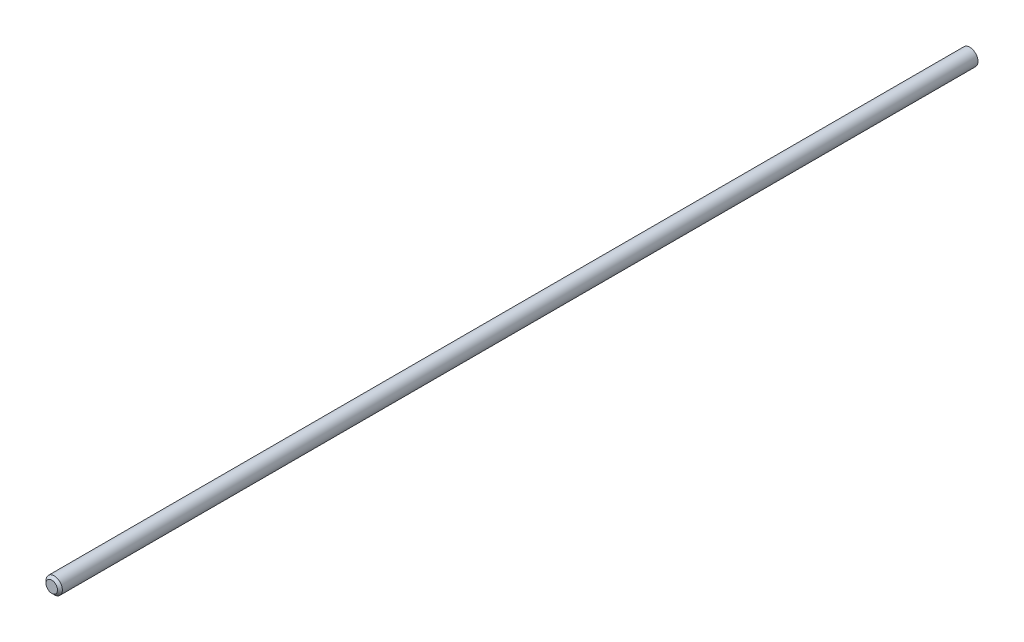
ISO-10303-21;
HEADER;
FILE_DESCRIPTION(('STEP AP214'),'2;1');
FILE_NAME('part.step','',(''),(''),'','','');
FILE_SCHEMA(('AUTOMOTIVE_DESIGN { 1 0 10303 214 1 1 1 1 }'));
ENDSEC;
DATA;
#1=APPLICATION_CONTEXT('core data for automotive mechanical design processes');
#2=APPLICATION_PROTOCOL_DEFINITION('international standard','automotive_design',2000,#1);
#3=PRODUCT_CONTEXT('',#1,'mechanical');
#4=PRODUCT('Part','Part','',(#3));
#5=PRODUCT_RELATED_PRODUCT_CATEGORY('part','',(#4));
#6=PRODUCT_DEFINITION_FORMATION('','',#4);
#7=PRODUCT_DEFINITION_CONTEXT('part definition',#1,'design');
#8=PRODUCT_DEFINITION('design','',#6,#7);
#9=PRODUCT_DEFINITION_SHAPE('','',#8);
#10=(LENGTH_UNIT() NAMED_UNIT(*) SI_UNIT(.MILLI.,.METRE.));
#11=(NAMED_UNIT(*) PLANE_ANGLE_UNIT() SI_UNIT($,.RADIAN.));
#12=(NAMED_UNIT(*) SI_UNIT($,.STERADIAN.) SOLID_ANGLE_UNIT());
#13=UNCERTAINTY_MEASURE_WITH_UNIT(LENGTH_MEASURE(1.E-05),#10,'distance_accuracy_value','');
#14=(GEOMETRIC_REPRESENTATION_CONTEXT(3) GLOBAL_UNCERTAINTY_ASSIGNED_CONTEXT((#13)) GLOBAL_UNIT_ASSIGNED_CONTEXT((#10,
#11,#12)) REPRESENTATION_CONTEXT('',''));
#15=CARTESIAN_POINT('',(0.,0.,0.));
#16=DIRECTION('',(0.,0.,1.));
#17=DIRECTION('',(1.,0.,0.));
#18=AXIS2_PLACEMENT_3D('',#15,#16,#17);
#19=CARTESIAN_POINT('',(0.,0.,304.8));
#20=DIRECTION('',(0.,0.,-1.));
#21=DIRECTION('',(-1.,0.,0.));
#22=AXIS2_PLACEMENT_3D('',#19,#20,#21);
#23=PLANE('',#22);
#24=CARTESIAN_POINT('',(0.,0.,304.8));
#25=DIRECTION('',(0.,0.,-1.));
#26=DIRECTION('',(-1.,0.,0.));
#27=AXIS2_PLACEMENT_3D('',#24,#25,#26);
#28=CIRCLE('',#27,2.22249999999996);
#29=CARTESIAN_POINT('',(-2.22249999999993,0.,304.8));
#30=VERTEX_POINT('',#29);
#31=EDGE_CURVE('E50',#30,#30,#28,.F.);
#32=ORIENTED_EDGE('',*,*,#31,.T.);
#33=EDGE_LOOP('',(#32));
#34=FACE_BOUND('',#33,.T.);
#35=ADVANCED_FACE('F42',(#34),#23,.F.);
#36=CARTESIAN_POINT('',(0.,0.,304.8));
#37=DIRECTION('',(0.,0.,1.));
#38=DIRECTION('',(1.,0.,0.));
#39=AXIS2_PLACEMENT_3D('',#36,#37,#38);
#40=CYLINDRICAL_SURFACE('',#39,3.17500000000011);
#41=CARTESIAN_POINT('',(0.,0.,-50.7999999999999));
#42=DIRECTION('',(0.,0.,1.));
#43=DIRECTION('',(1.,0.,0.));
#44=AXIS2_PLACEMENT_3D('',#41,#42,#43);
#45=CIRCLE('',#44,3.17500000000011);
#46=CARTESIAN_POINT('',(3.17500000000011,0.,-50.7999999999999));
#47=VERTEX_POINT('',#46);
#48=EDGE_CURVE('E10',#47,#47,#45,.T.);
#49=ORIENTED_EDGE('',*,*,#48,.T.);
#50=EDGE_LOOP('',(#49));
#51=FACE_BOUND('',#50,.T.);
#52=CARTESIAN_POINT('',(0.,0.,303.8475));
#53=DIRECTION('',(0.,0.,-1.));
#54=DIRECTION('',(-1.,0.,0.));
#55=AXIS2_PLACEMENT_3D('',#52,#53,#54);
#56=CIRCLE('',#55,3.17500000000011);
#57=CARTESIAN_POINT('',(-3.17500000000008,0.,303.8475));
#58=VERTEX_POINT('',#57);
#59=EDGE_CURVE('E55',#58,#58,#56,.T.);
#60=ORIENTED_EDGE('',*,*,#59,.T.);
#61=EDGE_LOOP('',(#60));
#62=FACE_BOUND('',#61,.T.);
#63=ADVANCED_FACE('F63',(#51,#62),#40,.T.);
#64=CARTESIAN_POINT('',(0.,0.,304.8));
#65=DIRECTION('',(0.,0.,-1.));
#66=DIRECTION('',(-1.,0.,0.));
#67=AXIS2_PLACEMENT_3D('',#64,#65,#66);
#68=CONICAL_SURFACE('',#67,2.22249999999996,0.785398163397458);
#69=CARTESIAN_POINT('',(-3.17500000000008,0.,303.8475));
#70=CARTESIAN_POINT('',(-3.16507812500007,0.,303.857421875));
#71=CARTESIAN_POINT('',(-3.15515625000007,0.,303.86734375));
#72=CARTESIAN_POINT('',(-3.13531250000007,0.,303.8871875));
#73=CARTESIAN_POINT('',(-3.12539062500008,0.,303.897109375));
#74=CARTESIAN_POINT('',(-3.10554687500007,0.,303.916953125));
#75=CARTESIAN_POINT('',(-3.09562500000007,0.,303.926875));
#76=CARTESIAN_POINT('',(-3.07578125000007,0.,303.94671875));
#77=CARTESIAN_POINT('',(-3.06585937500007,0.,303.956640625));
#78=CARTESIAN_POINT('',(-3.04601562500006,0.,303.976484375));
#79=CARTESIAN_POINT('',(-3.03609375000006,0.,303.98640625));
#80=CARTESIAN_POINT('',(-3.01625000000006,0.,304.00625));
#81=CARTESIAN_POINT('',(-3.00632812500006,0.,304.016171875));
#82=CARTESIAN_POINT('',(-2.98648437500005,0.,304.036015625));
#83=CARTESIAN_POINT('',(-2.97656250000005,0.,304.0459375));
#84=CARTESIAN_POINT('',(-2.95671875000005,0.,304.06578125));
#85=CARTESIAN_POINT('',(-2.94679687500005,0.,304.075703125));
#86=CARTESIAN_POINT('',(-2.92695312500005,0.,304.095546875));
#87=CARTESIAN_POINT('',(-2.91703125000004,0.,304.10546875));
#88=CARTESIAN_POINT('',(-2.89718750000003,0.,304.1253125));
#89=CARTESIAN_POINT('',(-2.88726562500004,0.,304.135234375));
#90=CARTESIAN_POINT('',(-2.86742187500004,0.,304.155078125));
#91=CARTESIAN_POINT('',(-2.85750000000003,0.,304.165));
#92=CARTESIAN_POINT('',(-2.83765625000003,0.,304.18484375));
#93=CARTESIAN_POINT('',(-2.82773437500003,0.,304.194765625));
#94=CARTESIAN_POINT('',(-2.80789062500003,0.,304.214609375));
#95=CARTESIAN_POINT('',(-2.79796875000002,0.,304.22453125));
#96=CARTESIAN_POINT('',(-2.77812500000002,0.,304.244375));
#97=CARTESIAN_POINT('',(-2.76820312500002,0.,304.254296875));
#98=CARTESIAN_POINT('',(-2.74835937500002,0.,304.274140625));
#99=CARTESIAN_POINT('',(-2.73843750000001,0.,304.2840625));
#100=CARTESIAN_POINT('',(-2.71859375000001,0.,304.30390625));
#101=CARTESIAN_POINT('',(-2.70867187500002,0.,304.313828125));
#102=CARTESIAN_POINT('',(-2.68882812500001,0.,304.333671875));
#103=CARTESIAN_POINT('',(-2.67890625,0.,304.34359375));
#104=CARTESIAN_POINT('',(-2.6590625,0.,304.3634375));
#105=CARTESIAN_POINT('',(-2.649140625,0.,304.373359375));
#106=CARTESIAN_POINT('',(-2.629296875,0.,304.393203125));
#107=CARTESIAN_POINT('',(-2.619375,0.,304.403125));
#108=CARTESIAN_POINT('',(-2.59953124999999,0.,304.42296875));
#109=CARTESIAN_POINT('',(-2.58960937499999,0.,304.432890625));
#110=CARTESIAN_POINT('',(-2.56976562499999,0.,304.452734375));
#111=CARTESIAN_POINT('',(-2.55984374999999,0.,304.46265625));
#112=CARTESIAN_POINT('',(-2.53999999999998,0.,304.4825));
#113=CARTESIAN_POINT('',(-2.53007812499998,0.,304.492421875));
#114=CARTESIAN_POINT('',(-2.51023437499998,0.,304.512265625));
#115=CARTESIAN_POINT('',(-2.50031249999997,0.,304.5221875));
#116=CARTESIAN_POINT('',(-2.48046874999997,0.,304.54203125));
#117=CARTESIAN_POINT('',(-2.47054687499998,0.,304.551953125));
#118=CARTESIAN_POINT('',(-2.45070312499997,0.,304.571796875));
#119=CARTESIAN_POINT('',(-2.44078124999996,0.,304.58171875));
#120=CARTESIAN_POINT('',(-2.42093749999996,0.,304.6015625));
#121=CARTESIAN_POINT('',(-2.41101562499996,0.,304.611484375));
#122=CARTESIAN_POINT('',(-2.39117187499996,0.,304.631328125));
#123=CARTESIAN_POINT('',(-2.38124999999996,0.,304.64125));
#124=CARTESIAN_POINT('',(-2.36140624999995,0.,304.66109375));
#125=CARTESIAN_POINT('',(-2.35148437499995,0.,304.671015625));
#126=CARTESIAN_POINT('',(-2.33164062499995,0.,304.690859375));
#127=CARTESIAN_POINT('',(-2.32171874999995,0.,304.70078125));
#128=CARTESIAN_POINT('',(-2.30187499999994,0.,304.720625));
#129=CARTESIAN_POINT('',(-2.29195312499994,0.,304.730546875));
#130=CARTESIAN_POINT('',(-2.27210937499994,0.,304.750390625));
#131=CARTESIAN_POINT('',(-2.26218749999994,0.,304.7603125));
#132=CARTESIAN_POINT('',(-2.24234374999994,0.,304.78015625));
#133=CARTESIAN_POINT('',(-2.23242187499994,0.,304.790078125));
#134=CARTESIAN_POINT('',(-2.22249999999993,0.,304.8));
#135=B_SPLINE_CURVE_WITH_KNOTS('',3,(#69,#70,#71,#72,#73,#74,#75,#76,#77,#78,#79,#80,#81,#82,
#83,#84,#85,#86,#87,#88,#89,#90,#91,#92,#93,#94,#95,#96,#97,#98,#99,#100,#101,#102,#103,#104,
#105,#106,#107,#108,#109,#110,#111,#112,#113,#114,#115,#116,#117,#118,#119,#120,#121,#122,#123,
#124,#125,#126,#127,#128,#129,#130,#131,#132,#133,#134),.UNSPECIFIED.,.F.,.F.,(4,2,2,2,2,2,2,2,
2,2,2,2,2,2,2,2,2,2,2,2,2,2,2,2,2,2,2,2,2,2,2,2,4),(0.,0.0420949505674835,0.0841899011350063,
0.126284851702529,0.168379802270052,0.210474752837575,0.252569703405098,0.294664653972621,
0.336759604540144,0.378854555107627,0.42094950567515,0.463044456242673,0.505139406810196,
0.547234357377719,0.589329307945242,0.631424258512765,0.673519209080287,0.715614159647771,
0.757709110215294,0.799804060782817,0.84189901135034,0.883993961917863,0.926088912485386,
0.968183863052909,1.01027881362043,1.05237376418792,1.09446871475544,1.13656366532296,
1.17865861589048,1.22075356645801,1.26284851702553,1.30494346759305,1.34703841816054),.UNSPECIFIED.);
#136=EDGE_CURVE('BSEAM44',#58,#30,#135,.T.);
#137=ORIENTED_EDGE('',*,*,#59,.F.);
#138=ORIENTED_EDGE('',*,*,#31,.F.);
#139=ORIENTED_EDGE('',*,*,#136,.T.);
#140=ORIENTED_EDGE('',*,*,#136,.F.);
#141=EDGE_LOOP('',(#137,#139,#138,#140));
#142=FACE_BOUND('',#141,.T.);
#143=ADVANCED_FACE('F44',(#142),#68,.T.);
#144=CARTESIAN_POINT('',(-3.17500000000011,25.4,-50.7999999999999));
#145=DIRECTION('',(0.,0.,1.));
#146=DIRECTION('',(1.,0.,0.));
#147=AXIS2_PLACEMENT_3D('',#144,#145,#146);
#148=PLANE('',#147);
#149=ORIENTED_EDGE('',*,*,#48,.F.);
#150=EDGE_LOOP('',(#149));
#151=FACE_BOUND('',#150,.T.);
#152=ADVANCED_FACE('F67',(#151),#148,.F.);
#153=CLOSED_SHELL('',(#35,#63,#143,#152));
#154=MANIFOLD_SOLID_BREP('B2',#153);
#155=ADVANCED_BREP_SHAPE_REPRESENTATION('',(#18,#154),#14);
#156=SHAPE_DEFINITION_REPRESENTATION(#9,#155);
ENDSEC;
END-ISO-10303-21;
